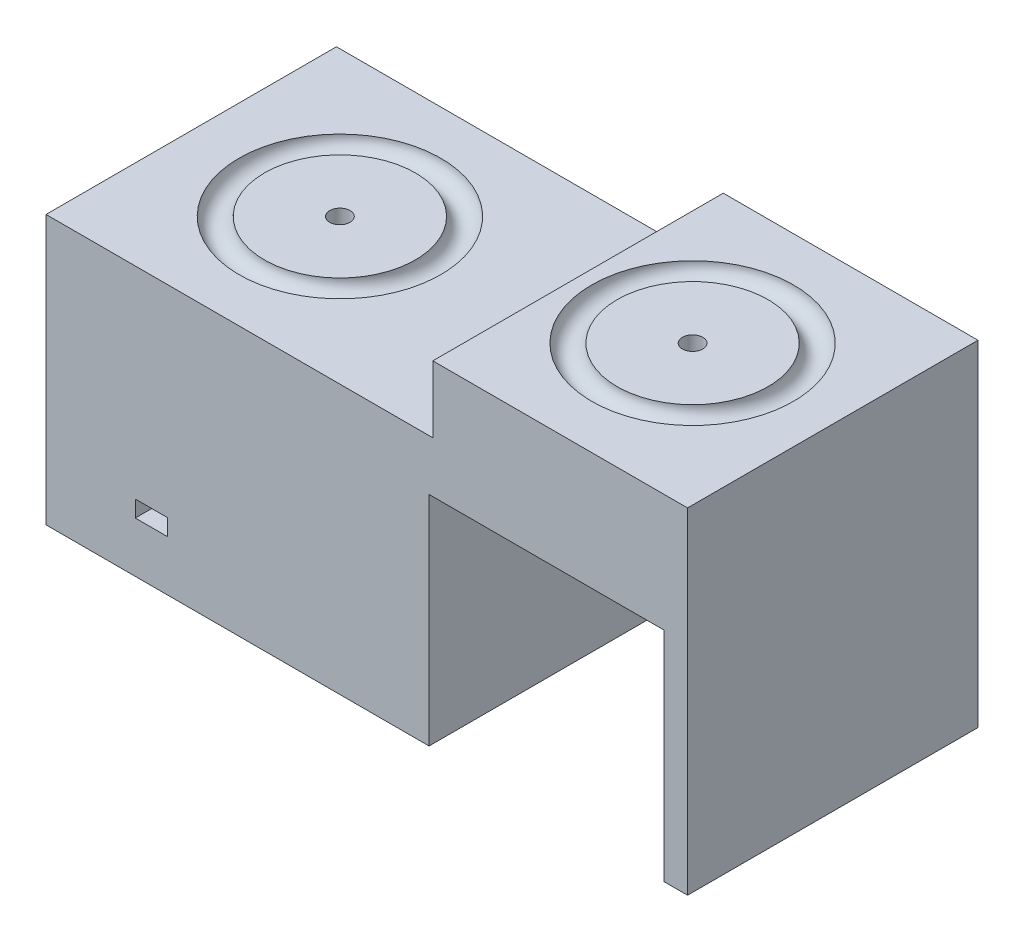
ISO-10303-21;
HEADER;
FILE_DESCRIPTION(('STEP AP214'),'2;1');
FILE_NAME('part.step','',(''),(''),'','','');
FILE_SCHEMA(('AUTOMOTIVE_DESIGN { 1 0 10303 214 1 1 1 1 }'));
ENDSEC;
DATA;
#1=APPLICATION_CONTEXT('core data for automotive mechanical design processes');
#2=APPLICATION_PROTOCOL_DEFINITION('international standard','automotive_design',2000,#1);
#3=PRODUCT_CONTEXT('',#1,'mechanical');
#4=PRODUCT('Part','Part','',(#3));
#5=PRODUCT_RELATED_PRODUCT_CATEGORY('part','',(#4));
#6=PRODUCT_DEFINITION_FORMATION('','',#4);
#7=PRODUCT_DEFINITION_CONTEXT('part definition',#1,'design');
#8=PRODUCT_DEFINITION('design','',#6,#7);
#9=PRODUCT_DEFINITION_SHAPE('','',#8);
#10=(LENGTH_UNIT() NAMED_UNIT(*) SI_UNIT(.MILLI.,.METRE.));
#11=(NAMED_UNIT(*) PLANE_ANGLE_UNIT() SI_UNIT($,.RADIAN.));
#12=(NAMED_UNIT(*) SI_UNIT($,.STERADIAN.) SOLID_ANGLE_UNIT());
#13=UNCERTAINTY_MEASURE_WITH_UNIT(LENGTH_MEASURE(1.E-05),#10,'distance_accuracy_value','');
#14=(GEOMETRIC_REPRESENTATION_CONTEXT(3) GLOBAL_UNCERTAINTY_ASSIGNED_CONTEXT((#13)) GLOBAL_UNIT_ASSIGNED_CONTEXT((#10,
#11,#12)) REPRESENTATION_CONTEXT('',''));
#15=CARTESIAN_POINT('',(0.,0.,0.));
#16=DIRECTION('',(0.,0.,1.));
#17=DIRECTION('',(1.,0.,0.));
#18=AXIS2_PLACEMENT_3D('',#15,#16,#17);
#19=CARTESIAN_POINT('',(0.,-51.6,65.2591921319689));
#20=DIRECTION('',(0.,0.,-1.));
#21=DIRECTION('',(-1.,0.,0.));
#22=AXIS2_PLACEMENT_3D('',#19,#20,#21);
#23=PLANE('',#22);
#24=DIRECTION('',(-1.,0.,0.));
#25=VECTOR('',#24,1.);
#26=CARTESIAN_POINT('',(0.,-38.7,65.2591921319689));
#27=LINE('',#26,#25);
#28=CARTESIAN_POINT('',(39.85,-38.7,65.2591921319689));
#29=VERTEX_POINT('',#28);
#30=CARTESIAN_POINT('',(31.65,-38.7,65.2591921319689));
#31=VERTEX_POINT('',#30);
#32=EDGE_CURVE('E298',#29,#31,#27,.T.);
#33=ORIENTED_EDGE('',*,*,#32,.T.);
#34=DIRECTION('',(0.,1.,0.));
#35=VECTOR('',#34,1.);
#36=CARTESIAN_POINT('',(31.65,-51.6,65.2591921319689));
#37=LINE('',#36,#35);
#38=CARTESIAN_POINT('',(31.65,-34.5,65.2591921319689));
#39=VERTEX_POINT('',#38);
#40=EDGE_CURVE('E304',#31,#39,#37,.T.);
#41=ORIENTED_EDGE('',*,*,#40,.T.);
#42=DIRECTION('',(1.,0.,0.));
#43=VECTOR('',#42,1.);
#44=CARTESIAN_POINT('',(0.,-34.5,65.2591921319689));
#45=LINE('',#44,#43);
#46=CARTESIAN_POINT('',(39.85,-34.5,65.2591921319689));
#47=VERTEX_POINT('',#46);
#48=EDGE_CURVE('E288',#39,#47,#45,.T.);
#49=ORIENTED_EDGE('',*,*,#48,.T.);
#50=DIRECTION('',(0.,-1.,0.));
#51=VECTOR('',#50,1.);
#52=CARTESIAN_POINT('',(39.85,-51.6,65.2591921319689));
#53=LINE('',#52,#51);
#54=EDGE_CURVE('E301',#47,#29,#53,.T.);
#55=ORIENTED_EDGE('',*,*,#54,.T.);
#56=EDGE_LOOP('',(#33,#41,#49,#55));
#57=FACE_BOUND('',#56,.T.);
#58=DIRECTION('',(0.,-1.,0.));
#59=VECTOR('',#58,1.);
#60=CARTESIAN_POINT('',(106.616116329824,-51.6,65.2591921319689));
#61=LINE('',#60,#59);
#62=CARTESIAN_POINT('',(106.616116329824,4.,65.2591921319689));
#63=VERTEX_POINT('',#62);
#64=CARTESIAN_POINT('',(106.616116329824,-51.6,65.2591921319689));
#65=VERTEX_POINT('',#64);
#66=EDGE_CURVE('E420',#63,#65,#61,.T.);
#67=ORIENTED_EDGE('',*,*,#66,.F.);
#68=DIRECTION('',(-1.,0.,0.));
#69=VECTOR('',#68,1.);
#70=CARTESIAN_POINT('',(0.,4.,65.2591921319689));
#71=LINE('',#70,#69);
#72=CARTESIAN_POINT('',(166.616116329824,4.,65.2591921319689));
#73=VERTEX_POINT('',#72);
#74=EDGE_CURVE('E433',#73,#63,#71,.T.);
#75=ORIENTED_EDGE('',*,*,#74,.F.);
#76=DIRECTION('',(0.,-1.,0.));
#77=VECTOR('',#76,1.);
#78=CARTESIAN_POINT('',(166.616116329824,-51.6,65.2591921319689));
#79=LINE('',#78,#77);
#80=CARTESIAN_POINT('',(166.616116329824,-51.6,65.2591921319689));
#81=VERTEX_POINT('',#80);
#82=EDGE_CURVE('E431',#73,#81,#79,.T.);
#83=ORIENTED_EDGE('',*,*,#82,.T.);
#84=DIRECTION('',(-1.,0.,0.));
#85=VECTOR('',#84,1.);
#86=CARTESIAN_POINT('',(0.,-51.6,65.2591921319689));
#87=LINE('',#86,#85);
#88=CARTESIAN_POINT('',(172.574486704563,-51.6,65.2591921319689));
#89=VERTEX_POINT('',#88);
#90=EDGE_CURVE('E226',#89,#81,#87,.T.);
#91=ORIENTED_EDGE('',*,*,#90,.F.);
#92=DIRECTION('',(0.,1.,0.));
#93=VECTOR('',#92,1.);
#94=CARTESIAN_POINT('',(172.574486704563,-51.6,65.2591921319689));
#95=LINE('',#94,#93);
#96=CARTESIAN_POINT('',(172.574486704563,34.,65.2591921319689));
#97=VERTEX_POINT('',#96);
#98=EDGE_CURVE('E362',#89,#97,#95,.T.);
#99=ORIENTED_EDGE('',*,*,#98,.T.);
#100=DIRECTION('',(1.,0.,0.));
#101=VECTOR('',#100,1.);
#102=CARTESIAN_POINT('',(172.574486704563,34.,65.2591921319689));
#103=LINE('',#102,#101);
#104=CARTESIAN_POINT('',(107.568912022522,34.,65.2591921319689));
#105=VERTEX_POINT('',#104);
#106=EDGE_CURVE('E336',#105,#97,#103,.T.);
#107=ORIENTED_EDGE('',*,*,#106,.F.);
#108=DIRECTION('',(0.,1.,0.));
#109=VECTOR('',#108,1.);
#110=CARTESIAN_POINT('',(107.568912022522,-5.6,65.2591921319689));
#111=LINE('',#110,#109);
#112=CARTESIAN_POINT('',(107.568912022522,17.,65.2591921319689));
#113=VERTEX_POINT('',#112);
#114=EDGE_CURVE('E340',#113,#105,#111,.T.);
#115=ORIENTED_EDGE('',*,*,#114,.F.);
#116=DIRECTION('',(1.,0.,0.));
#117=VECTOR('',#116,1.);
#118=CARTESIAN_POINT('',(8.85919213196888,17.,65.2591921319689));
#119=LINE('',#118,#117);
#120=CARTESIAN_POINT('',(8.85919213196888,17.,65.2591921319689));
#121=VERTEX_POINT('',#120);
#122=EDGE_CURVE('E355',#121,#113,#119,.T.);
#123=ORIENTED_EDGE('',*,*,#122,.F.);
#124=DIRECTION('',(0.,1.,0.));
#125=VECTOR('',#124,1.);
#126=CARTESIAN_POINT('',(8.85919213196888,-51.6,65.2591921319689));
#127=LINE('',#126,#125);
#128=CARTESIAN_POINT('',(8.85919213196888,-51.6,65.2591921319689));
#129=VERTEX_POINT('',#128);
#130=EDGE_CURVE('E360',#129,#121,#127,.T.);
#131=ORIENTED_EDGE('',*,*,#130,.F.);
#132=EDGE_CURVE('E233',#65,#129,#87,.T.);
#133=ORIENTED_EDGE('',*,*,#132,.F.);
#134=EDGE_LOOP('',(#67,#75,#83,#91,#99,#107,#115,#123,#131,#133));
#135=FACE_BOUND('',#134,.T.);
#136=ADVANCED_FACE('F43',(#57,#135),#23,.F.);
#137=CARTESIAN_POINT('',(0.,-51.6,0.));
#138=DIRECTION('',(0.,-1.,0.));
#139=DIRECTION('',(0.,0.,-1.));
#140=AXIS2_PLACEMENT_3D('',#137,#138,#139);
#141=PLANE('',#140);
#142=CARTESIAN_POINT('',(35.75,-51.6,12.9));
#143=DIRECTION('',(0.,-1.,0.));
#144=DIRECTION('',(0.,0.,-1.));
#145=AXIS2_PLACEMENT_3D('',#142,#143,#144);
#146=CIRCLE('',#145,2.6);
#147=CARTESIAN_POINT('',(35.75,-51.6,10.3));
#148=VERTEX_POINT('',#147);
#149=EDGE_CURVE('E311',#148,#148,#146,.T.);
#150=ORIENTED_EDGE('',*,*,#149,.F.);
#151=EDGE_LOOP('',(#150));
#152=FACE_BOUND('',#151,.T.);
#153=CARTESIAN_POINT('',(35.75,-51.6,43.5));
#154=DIRECTION('',(0.,-1.,0.));
#155=DIRECTION('',(0.,0.,-1.));
#156=AXIS2_PLACEMENT_3D('',#153,#154,#155);
#157=CIRCLE('',#156,2.6);
#158=CARTESIAN_POINT('',(35.75,-51.6,40.9));
#159=VERTEX_POINT('',#158);
#160=EDGE_CURVE('E315',#159,#159,#157,.T.);
#161=ORIENTED_EDGE('',*,*,#160,.F.);
#162=EDGE_LOOP('',(#161));
#163=FACE_BOUND('',#162,.T.);
#164=CARTESIAN_POINT('',(46.8,-51.6,28.2));
#165=DIRECTION('',(0.,-1.,0.));
#166=DIRECTION('',(0.,0.,-1.));
#167=AXIS2_PLACEMENT_3D('',#164,#165,#166);
#168=CIRCLE('',#167,12.);
#169=CARTESIAN_POINT('',(46.8,-51.6,16.2));
#170=VERTEX_POINT('',#169);
#171=EDGE_CURVE('E312',#170,#170,#168,.T.);
#172=ORIENTED_EDGE('',*,*,#171,.F.);
#173=EDGE_LOOP('',(#172));
#174=FACE_BOUND('',#173,.T.);
#175=DIRECTION('',(-1.,0.,0.));
#176=VECTOR('',#175,1.);
#177=CARTESIAN_POINT('',(0.,-51.6,-8.85919213196887));
#178=LINE('',#177,#176);
#179=CARTESIAN_POINT('',(106.616116329824,-51.6,-8.85919213196887));
#180=VERTEX_POINT('',#179);
#181=CARTESIAN_POINT('',(8.85919213196888,-51.6,-8.85919213196887));
#182=VERTEX_POINT('',#181);
#183=EDGE_CURVE('E234',#180,#182,#178,.T.);
#184=ORIENTED_EDGE('',*,*,#183,.F.);
#185=DIRECTION('',(0.,0.,-1.));
#186=VECTOR('',#185,1.);
#187=CARTESIAN_POINT('',(106.616116329824,-51.6,81.1408078680311));
#188=LINE('',#187,#186);
#189=EDGE_CURVE('E227',#65,#180,#188,.T.);
#190=ORIENTED_EDGE('',*,*,#189,.F.);
#191=ORIENTED_EDGE('',*,*,#132,.T.);
#192=DIRECTION('',(0.,0.,-1.));
#193=VECTOR('',#192,1.);
#194=CARTESIAN_POINT('',(8.85919213196888,-51.6,0.));
#195=LINE('',#194,#193);
#196=EDGE_CURVE('E239',#129,#182,#195,.T.);
#197=ORIENTED_EDGE('',*,*,#196,.T.);
#198=EDGE_LOOP('',(#184,#190,#191,#197));
#199=FACE_BOUND('',#198,.T.);
#200=ADVANCED_FACE('F449',(#152,#163,#174,#199),#141,.T.);
#201=CARTESIAN_POINT('',(0.,-51.6,-8.85919213196887));
#202=DIRECTION('',(0.,0.,-1.));
#203=DIRECTION('',(-1.,0.,0.));
#204=AXIS2_PLACEMENT_3D('',#201,#202,#203);
#205=PLANE('',#204);
#206=DIRECTION('',(0.,1.,0.));
#207=VECTOR('',#206,1.);
#208=CARTESIAN_POINT('',(31.65,-34.5,-8.85919213196887));
#209=LINE('',#208,#207);
#210=CARTESIAN_POINT('',(31.65,-38.7,-8.85919213196887));
#211=VERTEX_POINT('',#210);
#212=CARTESIAN_POINT('',(31.65,-34.5,-8.85919213196887));
#213=VERTEX_POINT('',#212);
#214=EDGE_CURVE('E259',#211,#213,#209,.T.);
#215=ORIENTED_EDGE('',*,*,#214,.F.);
#216=DIRECTION('',(-1.,0.,0.));
#217=VECTOR('',#216,1.);
#218=CARTESIAN_POINT('',(39.85,-38.7,-8.85919213196887));
#219=LINE('',#218,#217);
#220=CARTESIAN_POINT('',(39.85,-38.7,-8.85919213196887));
#221=VERTEX_POINT('',#220);
#222=EDGE_CURVE('E267',#221,#211,#219,.T.);
#223=ORIENTED_EDGE('',*,*,#222,.F.);
#224=DIRECTION('',(0.,-1.,0.));
#225=VECTOR('',#224,1.);
#226=CARTESIAN_POINT('',(39.85,-34.5,-8.85919213196887));
#227=LINE('',#226,#225);
#228=CARTESIAN_POINT('',(39.85,-34.5,-8.85919213196887));
#229=VERTEX_POINT('',#228);
#230=EDGE_CURVE('E264',#229,#221,#227,.T.);
#231=ORIENTED_EDGE('',*,*,#230,.F.);
#232=DIRECTION('',(1.,0.,0.));
#233=VECTOR('',#232,1.);
#234=CARTESIAN_POINT('',(39.85,-34.5,-8.85919213196887));
#235=LINE('',#234,#233);
#236=EDGE_CURVE('E261',#213,#229,#235,.T.);
#237=ORIENTED_EDGE('',*,*,#236,.F.);
#238=EDGE_LOOP('',(#215,#223,#231,#237));
#239=FACE_BOUND('',#238,.T.);
#240=DIRECTION('',(-1.,0.,0.));
#241=VECTOR('',#240,1.);
#242=CARTESIAN_POINT('',(136.616116329824,4.,-8.85919213196887));
#243=LINE('',#242,#241);
#244=CARTESIAN_POINT('',(166.616116329824,4.,-8.85919213196887));
#245=VERTEX_POINT('',#244);
#246=CARTESIAN_POINT('',(106.616116329824,4.,-8.85919213196887));
#247=VERTEX_POINT('',#246);
#248=EDGE_CURVE('E59',#245,#247,#243,.T.);
#249=ORIENTED_EDGE('',*,*,#248,.T.);
#250=DIRECTION('',(0.,-1.,0.));
#251=VECTOR('',#250,1.);
#252=CARTESIAN_POINT('',(106.616116329824,4.,-8.85919213196887));
#253=LINE('',#252,#251);
#254=EDGE_CURVE('E219',#247,#180,#253,.T.);
#255=ORIENTED_EDGE('',*,*,#254,.T.);
#256=ORIENTED_EDGE('',*,*,#183,.T.);
#257=DIRECTION('',(0.,1.,0.));
#258=VECTOR('',#257,1.);
#259=CARTESIAN_POINT('',(8.85919213196888,-51.6,-8.85919213196887));
#260=LINE('',#259,#258);
#261=CARTESIAN_POINT('',(8.85919213196888,17.,-8.85919213196887));
#262=VERTEX_POINT('',#261);
#263=EDGE_CURVE('E242',#182,#262,#260,.T.);
#264=ORIENTED_EDGE('',*,*,#263,.T.);
#265=DIRECTION('',(1.,0.,0.));
#266=VECTOR('',#265,1.);
#267=CARTESIAN_POINT('',(8.85919213196888,17.,-8.85919213196887));
#268=LINE('',#267,#266);
#269=CARTESIAN_POINT('',(107.568912022522,17.,-8.85919213196887));
#270=VERTEX_POINT('',#269);
#271=EDGE_CURVE('E352',#262,#270,#268,.T.);
#272=ORIENTED_EDGE('',*,*,#271,.T.);
#273=DIRECTION('',(0.,1.,0.));
#274=VECTOR('',#273,1.);
#275=CARTESIAN_POINT('',(107.568912022522,-5.6,-8.85919213196887));
#276=LINE('',#275,#274);
#277=CARTESIAN_POINT('',(107.568912022522,34.,-8.85919213196887));
#278=VERTEX_POINT('',#277);
#279=EDGE_CURVE('E339',#270,#278,#276,.T.);
#280=ORIENTED_EDGE('',*,*,#279,.T.);
#281=DIRECTION('',(-1.,0.,0.));
#282=VECTOR('',#281,1.);
#283=CARTESIAN_POINT('',(172.574486704563,34.,-8.85919213196887));
#284=LINE('',#283,#282);
#285=CARTESIAN_POINT('',(172.574486704563,34.,-8.85919213196887));
#286=VERTEX_POINT('',#285);
#287=EDGE_CURVE('E330',#286,#278,#284,.T.);
#288=ORIENTED_EDGE('',*,*,#287,.F.);
#289=DIRECTION('',(0.,1.,0.));
#290=VECTOR('',#289,1.);
#291=CARTESIAN_POINT('',(172.574486704563,-51.6,-8.85919213196887));
#292=LINE('',#291,#290);
#293=CARTESIAN_POINT('',(172.574486704563,-51.6,-8.85919213196887));
#294=VERTEX_POINT('',#293);
#295=EDGE_CURVE('E231',#294,#286,#292,.T.);
#296=ORIENTED_EDGE('',*,*,#295,.F.);
#297=CARTESIAN_POINT('',(166.616116329824,-51.6,-8.85919213196887));
#298=VERTEX_POINT('',#297);
#299=EDGE_CURVE('E224',#294,#298,#178,.T.);
#300=ORIENTED_EDGE('',*,*,#299,.T.);
#301=DIRECTION('',(0.,-1.,0.));
#302=VECTOR('',#301,1.);
#303=CARTESIAN_POINT('',(166.616116329824,4.,-8.85919213196887));
#304=LINE('',#303,#302);
#305=EDGE_CURVE('E211',#245,#298,#304,.T.);
#306=ORIENTED_EDGE('',*,*,#305,.F.);
#307=EDGE_LOOP('',(#249,#255,#256,#264,#272,#280,#288,#296,#300,#306));
#308=FACE_BOUND('',#307,.T.);
#309=ADVANCED_FACE('F229',(#239,#308),#205,.T.);
#310=CARTESIAN_POINT('',(136.8,24.,28.2));
#311=DIRECTION('',(0.,-1.,0.));
#312=DIRECTION('',(0.,0.,-1.));
#313=AXIS2_PLACEMENT_3D('',#310,#311,#312);
#314=CYLINDRICAL_SURFACE('',#313,20.5);
#315=CARTESIAN_POINT('',(136.8,17.,28.2));
#316=DIRECTION('',(0.,-1.,0.));
#317=DIRECTION('',(0.,0.,-1.));
#318=AXIS2_PLACEMENT_3D('',#315,#316,#317);
#319=CIRCLE('',#318,20.5);
#320=CARTESIAN_POINT('',(136.8,17.,7.70000000000002));
#321=VERTEX_POINT('',#320);
#322=CARTESIAN_POINT('',(136.8,17.,48.7));
#323=VERTEX_POINT('',#322);
#324=EDGE_CURVE('E12',#321,#323,#319,.F.);
#325=ORIENTED_EDGE('',*,*,#324,.T.);
#326=DIRECTION('',(0.,1.,0.));
#327=VECTOR('',#326,1.);
#328=CARTESIAN_POINT('',(136.8,29.5637733454495,48.7));
#329=LINE('',#328,#327);
#330=CARTESIAN_POINT('',(136.8,24.,48.7));
#331=VERTEX_POINT('',#330);
#332=EDGE_CURVE('E424',#323,#331,#329,.T.);
#333=ORIENTED_EDGE('',*,*,#332,.T.);
#334=CARTESIAN_POINT('',(136.8,24.,28.2));
#335=DIRECTION('',(0.,-1.,0.));
#336=DIRECTION('',(0.,0.,-1.));
#337=AXIS2_PLACEMENT_3D('',#334,#335,#336);
#338=CIRCLE('',#337,20.5);
#339=CARTESIAN_POINT('',(136.8,24.,7.70000000000001));
#340=VERTEX_POINT('',#339);
#341=EDGE_CURVE('E246',#340,#331,#338,.T.);
#342=ORIENTED_EDGE('',*,*,#341,.F.);
#343=DIRECTION('',(0.,-1.,0.));
#344=VECTOR('',#343,1.);
#345=CARTESIAN_POINT('',(136.8,24.,7.70000000000002));
#346=LINE('',#345,#344);
#347=EDGE_CURVE('E52',#340,#321,#346,.T.);
#348=ORIENTED_EDGE('',*,*,#347,.T.);
#349=EDGE_LOOP('',(#325,#333,#342,#348));
#350=FACE_BOUND('',#349,.T.);
#351=CARTESIAN_POINT('',(136.8,4.,28.2));
#352=DIRECTION('',(0.,-1.,0.));
#353=DIRECTION('',(0.,0.,-1.));
#354=AXIS2_PLACEMENT_3D('',#351,#352,#353);
#355=CIRCLE('',#354,20.5);
#356=CARTESIAN_POINT('',(136.8,4.,7.70000000000002));
#357=VERTEX_POINT('',#356);
#358=EDGE_CURVE('E47',#357,#357,#355,.F.);
#359=ORIENTED_EDGE('',*,*,#358,.F.);
#360=EDGE_LOOP('',(#359));
#361=FACE_BOUND('',#360,.T.);
#362=ADVANCED_FACE('F489',(#350,#361),#314,.F.);
#363=CARTESIAN_POINT('',(136.8,189.,28.2));
#364=DIRECTION('',(0.,-1.,0.));
#365=DIRECTION('',(0.,0.,-1.));
#366=AXIS2_PLACEMENT_3D('',#363,#364,#365);
#367=CYLINDRICAL_SURFACE('',#366,2.59999999999999);
#368=CARTESIAN_POINT('',(136.8,34.,28.2));
#369=DIRECTION('',(0.,1.,0.));
#370=DIRECTION('',(0.,0.,1.));
#371=AXIS2_PLACEMENT_3D('',#368,#369,#370);
#372=CIRCLE('',#371,2.59999999999999);
#373=CARTESIAN_POINT('',(136.8,34.,30.8));
#374=VERTEX_POINT('',#373);
#375=EDGE_CURVE('E256',#374,#374,#372,.T.);
#376=ORIENTED_EDGE('',*,*,#375,.T.);
#377=EDGE_LOOP('',(#376));
#378=FACE_BOUND('',#377,.T.);
#379=CARTESIAN_POINT('',(136.8,24.,28.2));
#380=DIRECTION('',(0.,-1.,0.));
#381=DIRECTION('',(0.,0.,-1.));
#382=AXIS2_PLACEMENT_3D('',#379,#380,#381);
#383=CIRCLE('',#382,2.59999999999999);
#384=CARTESIAN_POINT('',(136.8,24.,30.8));
#385=VERTEX_POINT('',#384);
#386=CARTESIAN_POINT('',(136.8,24.,25.6));
#387=VERTEX_POINT('',#386);
#388=EDGE_CURVE('E243',#385,#387,#383,.F.);
#389=ORIENTED_EDGE('',*,*,#388,.F.);
#390=DIRECTION('',(0.,-1.,0.));
#391=VECTOR('',#390,1.);
#392=CARTESIAN_POINT('',(136.8,189.,30.8));
#393=LINE('',#392,#391);
#394=CARTESIAN_POINT('',(136.8,29.5637733454495,30.8));
#395=VERTEX_POINT('',#394);
#396=EDGE_CURVE('E398',#385,#395,#393,.F.);
#397=ORIENTED_EDGE('',*,*,#396,.T.);
#398=CARTESIAN_POINT('',(136.8,29.5637733454495,28.2));
#399=DIRECTION('',(0.,1.,0.));
#400=DIRECTION('',(0.,0.,1.));
#401=AXIS2_PLACEMENT_3D('',#398,#399,#400);
#402=CIRCLE('',#401,2.59999999999999);
#403=CARTESIAN_POINT('',(136.8,29.5637733454495,25.6));
#404=VERTEX_POINT('',#403);
#405=EDGE_CURVE('E391',#395,#404,#402,.F.);
#406=ORIENTED_EDGE('',*,*,#405,.T.);
#407=DIRECTION('',(0.,-1.,0.));
#408=VECTOR('',#407,1.);
#409=CARTESIAN_POINT('',(136.8,189.,25.6));
#410=LINE('',#409,#408);
#411=EDGE_CURVE('E394',#404,#387,#410,.T.);
#412=ORIENTED_EDGE('',*,*,#411,.T.);
#413=EDGE_LOOP('',(#389,#397,#406,#412));
#414=FACE_BOUND('',#413,.T.);
#415=ADVANCED_FACE('F492',(#378,#414),#367,.F.);
#416=CARTESIAN_POINT('',(8.85919213196888,-5.60000000000001,65.2591921319689));
#417=DIRECTION('',(-1.,0.,0.));
#418=DIRECTION('',(0.,0.,1.));
#419=AXIS2_PLACEMENT_3D('',#416,#417,#418);
#420=PLANE('',#419);
#421=ORIENTED_EDGE('',*,*,#196,.F.);
#422=ORIENTED_EDGE('',*,*,#130,.T.);
#423=DIRECTION('',(0.,0.,-1.));
#424=VECTOR('',#423,1.);
#425=CARTESIAN_POINT('',(8.85919213196888,17.,65.2591921319689));
#426=LINE('',#425,#424);
#427=EDGE_CURVE('E349',#121,#262,#426,.T.);
#428=ORIENTED_EDGE('',*,*,#427,.T.);
#429=ORIENTED_EDGE('',*,*,#263,.F.);
#430=EDGE_LOOP('',(#421,#422,#428,#429));
#431=FACE_BOUND('',#430,.T.);
#432=ADVANCED_FACE('F454',(#431),#420,.T.);
#433=CARTESIAN_POINT('',(46.8,172.,28.2));
#434=DIRECTION('',(0.,-1.,0.));
#435=DIRECTION('',(0.,0.,-1.));
#436=AXIS2_PLACEMENT_3D('',#433,#434,#435);
#437=CYLINDRICAL_SURFACE('',#436,2.6);
#438=CARTESIAN_POINT('',(46.8,1.99999999999999,28.2));
#439=DIRECTION('',(0.,-1.,0.));
#440=DIRECTION('',(0.,0.,-1.));
#441=AXIS2_PLACEMENT_3D('',#438,#439,#440);
#442=CIRCLE('',#441,2.6);
#443=CARTESIAN_POINT('',(46.8,1.99999999999999,25.6));
#444=VERTEX_POINT('',#443);
#445=EDGE_CURVE('E248',#444,#444,#442,.T.);
#446=ORIENTED_EDGE('',*,*,#445,.T.);
#447=EDGE_LOOP('',(#446));
#448=FACE_BOUND('',#447,.T.);
#449=CARTESIAN_POINT('',(46.8,17.,28.2));
#450=DIRECTION('',(0.,-1.,0.));
#451=DIRECTION('',(0.,0.,-1.));
#452=AXIS2_PLACEMENT_3D('',#449,#450,#451);
#453=CIRCLE('',#452,2.6);
#454=CARTESIAN_POINT('',(46.8,17.,25.6));
#455=VERTEX_POINT('',#454);
#456=EDGE_CURVE('E252',#455,#455,#453,.T.);
#457=ORIENTED_EDGE('',*,*,#456,.F.);
#458=EDGE_LOOP('',(#457));
#459=FACE_BOUND('',#458,.T.);
#460=ADVANCED_FACE('F598',(#448,#459),#437,.F.);
#461=CARTESIAN_POINT('',(0.,34.,0.));
#462=DIRECTION('',(0.,1.,0.));
#463=DIRECTION('',(0.,0.,1.));
#464=AXIS2_PLACEMENT_3D('',#461,#462,#463);
#465=PLANE('',#464);
#466=ORIENTED_EDGE('',*,*,#375,.F.);
#467=EDGE_LOOP('',(#466));
#468=FACE_BOUND('',#467,.T.);
#469=CARTESIAN_POINT('',(136.8,34.,28.2));
#470=DIRECTION('',(0.,-1.,0.));
#471=DIRECTION('',(0.,0.,-1.));
#472=AXIS2_PLACEMENT_3D('',#469,#470,#471);
#473=CIRCLE('',#472,19.25);
#474=CARTESIAN_POINT('',(117.55,34.,28.2));
#475=VERTEX_POINT('',#474);
#476=EDGE_CURVE('E371',#475,#475,#473,.F.);
#477=ORIENTED_EDGE('',*,*,#476,.T.);
#478=EDGE_LOOP('',(#477));
#479=FACE_BOUND('',#478,.T.);
#480=ADVANCED_FACE('F573',(#468,#479),#465,.T.);
#481=CARTESIAN_POINT('',(35.75,-21.6,43.5));
#482=DIRECTION('',(0.,-1.,0.));
#483=DIRECTION('',(0.,0.,-1.));
#484=AXIS2_PLACEMENT_3D('',#481,#482,#483);
#485=PLANE('',#484);
#486=CARTESIAN_POINT('',(35.75,-21.6,43.5));
#487=DIRECTION('',(0.,-1.,0.));
#488=DIRECTION('',(0.,0.,-1.));
#489=AXIS2_PLACEMENT_3D('',#486,#487,#488);
#490=CIRCLE('',#489,2.6);
#491=CARTESIAN_POINT('',(35.75,-21.6,40.9));
#492=VERTEX_POINT('',#491);
#493=EDGE_CURVE('E307',#492,#492,#490,.T.);
#494=ORIENTED_EDGE('',*,*,#493,.T.);
#495=EDGE_LOOP('',(#494));
#496=FACE_BOUND('',#495,.T.);
#497=ADVANCED_FACE('F566',(#496),#485,.T.);
#498=CARTESIAN_POINT('',(0.,-21.6,0.));
#499=DIRECTION('',(0.,-1.,0.));
#500=DIRECTION('',(0.,0.,-1.));
#501=AXIS2_PLACEMENT_3D('',#498,#499,#500);
#502=PLANE('',#501);
#503=CARTESIAN_POINT('',(35.75,-21.6,12.9));
#504=DIRECTION('',(0.,-1.,0.));
#505=DIRECTION('',(0.,0.,-1.));
#506=AXIS2_PLACEMENT_3D('',#503,#504,#505);
#507=CIRCLE('',#506,2.6);
#508=CARTESIAN_POINT('',(35.75,-21.6,10.3));
#509=VERTEX_POINT('',#508);
#510=EDGE_CURVE('E308',#509,#509,#507,.T.);
#511=ORIENTED_EDGE('',*,*,#510,.T.);
#512=EDGE_LOOP('',(#511));
#513=FACE_BOUND('',#512,.T.);
#514=ADVANCED_FACE('F555',(#513),#502,.T.);
#515=CARTESIAN_POINT('',(46.8,1.99999999999999,28.2));
#516=DIRECTION('',(0.,-1.,0.));
#517=DIRECTION('',(0.,0.,-1.));
#518=AXIS2_PLACEMENT_3D('',#515,#516,#517);
#519=PLANE('',#518);
#520=ORIENTED_EDGE('',*,*,#445,.F.);
#521=EDGE_LOOP('',(#520));
#522=FACE_BOUND('',#521,.T.);
#523=CARTESIAN_POINT('',(46.8,1.99999999999999,28.2));
#524=DIRECTION('',(0.,-1.,0.));
#525=DIRECTION('',(0.,0.,-1.));
#526=AXIS2_PLACEMENT_3D('',#523,#524,#525);
#527=CIRCLE('',#526,12.);
#528=CARTESIAN_POINT('',(46.8,1.99999999999999,16.2));
#529=VERTEX_POINT('',#528);
#530=EDGE_CURVE('E320',#529,#529,#527,.T.);
#531=ORIENTED_EDGE('',*,*,#530,.T.);
#532=EDGE_LOOP('',(#531));
#533=FACE_BOUND('',#532,.T.);
#534=ADVANCED_FACE('F552',(#522,#533),#519,.T.);
#535=CARTESIAN_POINT('',(0.,17.,0.));
#536=DIRECTION('',(0.,-1.,0.));
#537=DIRECTION('',(0.,0.,-1.));
#538=AXIS2_PLACEMENT_3D('',#535,#536,#537);
#539=PLANE('',#538);
#540=ORIENTED_EDGE('',*,*,#456,.T.);
#541=EDGE_LOOP('',(#540));
#542=FACE_BOUND('',#541,.T.);
#543=CARTESIAN_POINT('',(46.8,17.,28.2));
#544=DIRECTION('',(0.,1.,0.));
#545=DIRECTION('',(0.,0.,1.));
#546=AXIS2_PLACEMENT_3D('',#543,#544,#545);
#547=CIRCLE('',#546,19.25);
#548=CARTESIAN_POINT('',(27.55,17.,28.2));
#549=VERTEX_POINT('',#548);
#550=EDGE_CURVE('E237',#549,#549,#547,.F.);
#551=ORIENTED_EDGE('',*,*,#550,.F.);
#552=EDGE_LOOP('',(#551));
#553=FACE_BOUND('',#552,.T.);
#554=ADVANCED_FACE('F554',(#542,#553),#539,.F.);
#555=CARTESIAN_POINT('',(136.8,34.,28.2));
#556=DIRECTION('',(0.,1.,0.));
#557=DIRECTION('',(0.,0.,1.));
#558=AXIS2_PLACEMENT_3D('',#555,#556,#557);
#559=TOROIDAL_SURFACE('',#558,22.5,3.25000000000001);
#560=CARTESIAN_POINT('',(114.3,34.,28.2));
#561=DIRECTION('',(0.,0.,-1.));
#562=DIRECTION('',(-1.,0.,0.));
#563=AXIS2_PLACEMENT_3D('',#560,#561,#562);
#564=CIRCLE('',#563,3.25000000000001);
#565=CARTESIAN_POINT('',(111.05,34.,28.2));
#566=VERTEX_POINT('',#565);
#567=EDGE_CURVE('E323',#475,#566,#564,.T.);
#568=ORIENTED_EDGE('',*,*,#567,.F.);
#569=ORIENTED_EDGE('',*,*,#476,.F.);
#570=ORIENTED_EDGE('',*,*,#567,.T.);
#571=CARTESIAN_POINT('',(136.8,34.,28.2));
#572=DIRECTION('',(0.,1.,0.));
#573=DIRECTION('',(0.,0.,1.));
#574=AXIS2_PLACEMENT_3D('',#571,#572,#573);
#575=CIRCLE('',#574,25.75);
#576=EDGE_CURVE('E374',#566,#566,#575,.F.);
#577=ORIENTED_EDGE('',*,*,#576,.F.);
#578=EDGE_LOOP('',(#568,#569,#570,#577));
#579=FACE_BOUND('',#578,.T.);
#580=ADVANCED_FACE('F562',(#579),#559,.F.);
#581=CARTESIAN_POINT('',(35.75,-21.6,43.5));
#582=DIRECTION('',(0.,-1.,0.));
#583=DIRECTION('',(0.,0.,-1.));
#584=AXIS2_PLACEMENT_3D('',#581,#582,#583);
#585=CYLINDRICAL_SURFACE('',#584,2.6);
#586=CARTESIAN_POINT('',(35.75,-34.5,43.5));
#587=DIRECTION('',(0.,1.,0.));
#588=DIRECTION('',(0.,0.,1.));
#589=AXIS2_PLACEMENT_3D('',#586,#587,#588);
#590=CIRCLE('',#589,2.6);
#591=CARTESIAN_POINT('',(35.75,-34.5,46.1));
#592=VERTEX_POINT('',#591);
#593=EDGE_CURVE('E282',#592,#592,#590,.F.);
#594=ORIENTED_EDGE('',*,*,#593,.T.);
#595=EDGE_LOOP('',(#594));
#596=FACE_BOUND('',#595,.T.);
#597=ORIENTED_EDGE('',*,*,#493,.F.);
#598=EDGE_LOOP('',(#597));
#599=FACE_BOUND('',#598,.T.);
#600=ADVANCED_FACE('F575',(#596,#599),#585,.F.);
#601=CARTESIAN_POINT('',(35.75,-21.6,12.9));
#602=DIRECTION('',(0.,-1.,0.));
#603=DIRECTION('',(0.,0.,-1.));
#604=AXIS2_PLACEMENT_3D('',#601,#602,#603);
#605=CYLINDRICAL_SURFACE('',#604,2.6);
#606=CARTESIAN_POINT('',(35.75,-34.5,12.9));
#607=DIRECTION('',(0.,1.,0.));
#608=DIRECTION('',(0.,0.,1.));
#609=AXIS2_PLACEMENT_3D('',#606,#607,#608);
#610=CIRCLE('',#609,2.6);
#611=CARTESIAN_POINT('',(35.75,-34.5,15.5));
#612=VERTEX_POINT('',#611);
#613=EDGE_CURVE('E274',#612,#612,#610,.F.);
#614=ORIENTED_EDGE('',*,*,#613,.T.);
#615=EDGE_LOOP('',(#614));
#616=FACE_BOUND('',#615,.T.);
#617=ORIENTED_EDGE('',*,*,#510,.F.);
#618=EDGE_LOOP('',(#617));
#619=FACE_BOUND('',#618,.T.);
#620=ADVANCED_FACE('F578',(#616,#619),#605,.F.);
#621=CARTESIAN_POINT('',(35.75,-38.7,12.9));
#622=DIRECTION('',(0.,-1.,0.));
#623=DIRECTION('',(0.,0.,-1.));
#624=AXIS2_PLACEMENT_3D('',#621,#622,#623);
#625=CIRCLE('',#624,2.6);
#626=CARTESIAN_POINT('',(35.75,-38.7,10.3));
#627=VERTEX_POINT('',#626);
#628=EDGE_CURVE('E291',#627,#627,#625,.F.);
#629=ORIENTED_EDGE('',*,*,#628,.T.);
#630=EDGE_LOOP('',(#629));
#631=FACE_BOUND('',#630,.T.);
#632=ORIENTED_EDGE('',*,*,#149,.T.);
#633=EDGE_LOOP('',(#632));
#634=FACE_BOUND('',#633,.T.);
#635=ADVANCED_FACE('F581',(#631,#634),#605,.F.);
#636=CARTESIAN_POINT('',(35.75,-38.7,43.5));
#637=DIRECTION('',(0.,-1.,0.));
#638=DIRECTION('',(0.,0.,-1.));
#639=AXIS2_PLACEMENT_3D('',#636,#637,#638);
#640=CIRCLE('',#639,2.6);
#641=CARTESIAN_POINT('',(35.75,-38.7,40.9));
#642=VERTEX_POINT('',#641);
#643=EDGE_CURVE('E292',#642,#642,#640,.F.);
#644=ORIENTED_EDGE('',*,*,#643,.T.);
#645=EDGE_LOOP('',(#644));
#646=FACE_BOUND('',#645,.T.);
#647=ORIENTED_EDGE('',*,*,#160,.T.);
#648=EDGE_LOOP('',(#647));
#649=FACE_BOUND('',#648,.T.);
#650=ADVANCED_FACE('F545',(#646,#649),#585,.F.);
#651=CARTESIAN_POINT('',(46.8,1.99999999999999,28.2));
#652=DIRECTION('',(0.,-1.,0.));
#653=DIRECTION('',(0.,0.,-1.));
#654=AXIS2_PLACEMENT_3D('',#651,#652,#653);
#655=CYLINDRICAL_SURFACE('',#654,12.);
#656=DIRECTION('',(0.,-1.,0.));
#657=VECTOR('',#656,1.);
#658=CARTESIAN_POINT('',(39.85,1.99999999999999,18.4174900971172));
#659=LINE('',#658,#657);
#660=CARTESIAN_POINT('',(39.85,-34.5,18.4174900971172));
#661=VERTEX_POINT('',#660);
#662=CARTESIAN_POINT('',(39.85,-38.7,18.4174900971172));
#663=VERTEX_POINT('',#662);
#664=EDGE_CURVE('E377',#661,#663,#659,.T.);
#665=ORIENTED_EDGE('',*,*,#664,.T.);
#666=CARTESIAN_POINT('',(46.8,-38.7,28.2));
#667=DIRECTION('',(0.,-1.,0.));
#668=DIRECTION('',(0.,0.,-1.));
#669=AXIS2_PLACEMENT_3D('',#666,#667,#668);
#670=CIRCLE('',#669,12.);
#671=CARTESIAN_POINT('',(39.85,-38.7,37.9825099028828));
#672=VERTEX_POINT('',#671);
#673=EDGE_CURVE('E295',#663,#672,#670,.F.);
#674=ORIENTED_EDGE('',*,*,#673,.T.);
#675=DIRECTION('',(0.,-1.,0.));
#676=VECTOR('',#675,1.);
#677=CARTESIAN_POINT('',(39.85,1.99999999999999,37.9825099028828));
#678=LINE('',#677,#676);
#679=CARTESIAN_POINT('',(39.85,-34.5,37.9825099028828));
#680=VERTEX_POINT('',#679);
#681=EDGE_CURVE('E384',#672,#680,#678,.F.);
#682=ORIENTED_EDGE('',*,*,#681,.T.);
#683=CARTESIAN_POINT('',(46.8,-34.5,28.2));
#684=DIRECTION('',(0.,1.,0.));
#685=DIRECTION('',(0.,0.,1.));
#686=AXIS2_PLACEMENT_3D('',#683,#684,#685);
#687=CIRCLE('',#686,12.);
#688=EDGE_CURVE('E285',#680,#661,#687,.F.);
#689=ORIENTED_EDGE('',*,*,#688,.T.);
#690=EDGE_LOOP('',(#665,#674,#682,#689));
#691=FACE_BOUND('',#690,.T.);
#692=ORIENTED_EDGE('',*,*,#530,.F.);
#693=EDGE_LOOP('',(#692));
#694=FACE_BOUND('',#693,.T.);
#695=ORIENTED_EDGE('',*,*,#171,.T.);
#696=EDGE_LOOP('',(#695));
#697=FACE_BOUND('',#696,.T.);
#698=ADVANCED_FACE('F542',(#691,#694,#697),#655,.F.);
#699=CARTESIAN_POINT('',(39.85,-34.5,85.2591921319689));
#700=DIRECTION('',(1.,0.,0.));
#701=DIRECTION('',(0.,0.,-1.));
#702=AXIS2_PLACEMENT_3D('',#699,#700,#701);
#703=PLANE('',#702);
#704=DIRECTION('',(0.,0.,-1.));
#705=VECTOR('',#704,1.);
#706=CARTESIAN_POINT('',(39.85,-34.5,85.2591921319689));
#707=LINE('',#706,#705);
#708=EDGE_CURVE('E277',#47,#680,#707,.T.);
#709=ORIENTED_EDGE('',*,*,#708,.T.);
#710=ORIENTED_EDGE('',*,*,#681,.F.);
#711=DIRECTION('',(0.,0.,-1.));
#712=VECTOR('',#711,1.);
#713=CARTESIAN_POINT('',(39.85,-38.7,85.2591921319689));
#714=LINE('',#713,#712);
#715=EDGE_CURVE('E273',#29,#672,#714,.T.);
#716=ORIENTED_EDGE('',*,*,#715,.F.);
#717=ORIENTED_EDGE('',*,*,#54,.F.);
#718=EDGE_LOOP('',(#709,#710,#716,#717));
#719=FACE_BOUND('',#718,.T.);
#720=ADVANCED_FACE('F541',(#719),#703,.F.);
#721=CARTESIAN_POINT('',(46.8,17.,28.2));
#722=DIRECTION('',(0.,1.,0.));
#723=DIRECTION('',(0.,0.,1.));
#724=AXIS2_PLACEMENT_3D('',#721,#722,#723);
#725=TOROIDAL_SURFACE('',#724,22.5,3.25);
#726=CARTESIAN_POINT('',(46.8,17.,28.2));
#727=DIRECTION('',(0.,-1.,0.));
#728=DIRECTION('',(0.,0.,-1.));
#729=AXIS2_PLACEMENT_3D('',#726,#727,#728);
#730=CIRCLE('',#729,25.75);
#731=CARTESIAN_POINT('',(21.05,17.,28.2));
#732=VERTEX_POINT('',#731);
#733=EDGE_CURVE('E368',#732,#732,#730,.F.);
#734=ORIENTED_EDGE('',*,*,#733,.T.);
#735=CARTESIAN_POINT('',(24.3,17.,28.2));
#736=DIRECTION('',(0.,0.,-1.));
#737=DIRECTION('',(-1.,0.,0.));
#738=AXIS2_PLACEMENT_3D('',#735,#736,#737);
#739=CIRCLE('',#738,3.25);
#740=EDGE_CURVE('E347',#549,#732,#739,.T.);
#741=ORIENTED_EDGE('',*,*,#740,.F.);
#742=ORIENTED_EDGE('',*,*,#550,.T.);
#743=ORIENTED_EDGE('',*,*,#740,.T.);
#744=EDGE_LOOP('',(#734,#741,#742,#743));
#745=FACE_BOUND('',#744,.T.);
#746=ADVANCED_FACE('F592',(#745),#725,.F.);
#747=CARTESIAN_POINT('',(172.574486704563,-51.6,65.2591921319689));
#748=DIRECTION('',(1.,0.,0.));
#749=DIRECTION('',(0.,0.,-1.));
#750=AXIS2_PLACEMENT_3D('',#747,#748,#749);
#751=PLANE('',#750);
#752=DIRECTION('',(0.,0.,-1.));
#753=VECTOR('',#752,1.);
#754=CARTESIAN_POINT('',(172.574486704563,34.,65.2591921319689));
#755=LINE('',#754,#753);
#756=EDGE_CURVE('E327',#97,#286,#755,.T.);
#757=ORIENTED_EDGE('',*,*,#756,.F.);
#758=ORIENTED_EDGE('',*,*,#98,.F.);
#759=DIRECTION('',(0.,0.,-1.));
#760=VECTOR('',#759,1.);
#761=CARTESIAN_POINT('',(172.574486704563,-51.6,65.2591921319689));
#762=LINE('',#761,#760);
#763=EDGE_CURVE('E358',#89,#294,#762,.T.);
#764=ORIENTED_EDGE('',*,*,#763,.T.);
#765=ORIENTED_EDGE('',*,*,#295,.T.);
#766=EDGE_LOOP('',(#757,#758,#764,#765));
#767=FACE_BOUND('',#766,.T.);
#768=ADVANCED_FACE('F474',(#767),#751,.T.);
#769=ORIENTED_EDGE('',*,*,#756,.T.);
#770=ORIENTED_EDGE('',*,*,#287,.T.);
#771=DIRECTION('',(0.,0.,1.));
#772=VECTOR('',#771,1.);
#773=CARTESIAN_POINT('',(107.568912022522,34.,65.2591921319689));
#774=LINE('',#773,#772);
#775=EDGE_CURVE('E333',#278,#105,#774,.T.);
#776=ORIENTED_EDGE('',*,*,#775,.T.);
#777=ORIENTED_EDGE('',*,*,#106,.T.);
#778=EDGE_LOOP('',(#769,#770,#776,#777));
#779=FACE_BOUND('',#778,.T.);
#780=ORIENTED_EDGE('',*,*,#576,.T.);
#781=EDGE_LOOP('',(#780));
#782=FACE_BOUND('',#781,.T.);
#783=ADVANCED_FACE('F468',(#779,#782),#465,.T.);
#784=CARTESIAN_POINT('',(107.568912022522,-5.6,65.2591921319689));
#785=DIRECTION('',(-1.,0.,0.));
#786=DIRECTION('',(0.,0.,1.));
#787=AXIS2_PLACEMENT_3D('',#784,#785,#786);
#788=PLANE('',#787);
#789=DIRECTION('',(0.,-1.,0.));
#790=VECTOR('',#789,1.);
#791=CARTESIAN_POINT('',(107.568912022522,17.,7.70000000000001));
#792=LINE('',#791,#790);
#793=CARTESIAN_POINT('',(107.568912022522,29.5637733454495,7.70000000000001));
#794=VERTEX_POINT('',#793);
#795=CARTESIAN_POINT('',(107.568912022522,17.,7.70000000000001));
#796=VERTEX_POINT('',#795);
#797=EDGE_CURVE('E67',#794,#796,#792,.T.);
#798=ORIENTED_EDGE('',*,*,#797,.F.);
#799=DIRECTION('',(0.,0.,-1.));
#800=VECTOR('',#799,1.);
#801=CARTESIAN_POINT('',(107.568912022522,29.5637733454495,7.70000000000001));
#802=LINE('',#801,#800);
#803=CARTESIAN_POINT('',(107.568912022522,29.5637733454495,48.7));
#804=VERTEX_POINT('',#803);
#805=EDGE_CURVE('E412',#804,#794,#802,.T.);
#806=ORIENTED_EDGE('',*,*,#805,.F.);
#807=DIRECTION('',(0.,1.,0.));
#808=VECTOR('',#807,1.);
#809=CARTESIAN_POINT('',(107.568912022522,29.5637733454495,48.7));
#810=LINE('',#809,#808);
#811=CARTESIAN_POINT('',(107.568912022522,17.,48.7));
#812=VERTEX_POINT('',#811);
#813=EDGE_CURVE('E416',#812,#804,#810,.T.);
#814=ORIENTED_EDGE('',*,*,#813,.F.);
#815=DIRECTION('',(0.,0.,-1.));
#816=VECTOR('',#815,1.);
#817=CARTESIAN_POINT('',(107.568912022522,17.,0.));
#818=LINE('',#817,#816);
#819=EDGE_CURVE('E342',#113,#812,#818,.T.);
#820=ORIENTED_EDGE('',*,*,#819,.F.);
#821=ORIENTED_EDGE('',*,*,#114,.T.);
#822=ORIENTED_EDGE('',*,*,#775,.F.);
#823=ORIENTED_EDGE('',*,*,#279,.F.);
#824=EDGE_CURVE('E346',#796,#270,#818,.T.);
#825=ORIENTED_EDGE('',*,*,#824,.F.);
#826=EDGE_LOOP('',(#798,#806,#814,#820,#821,#822,#823,#825));
#827=FACE_BOUND('',#826,.T.);
#828=ADVANCED_FACE('F466',(#827),#788,.T.);
#829=ORIENTED_EDGE('',*,*,#122,.T.);
#830=ORIENTED_EDGE('',*,*,#819,.T.);
#831=DIRECTION('',(-1.,0.,0.));
#832=VECTOR('',#831,1.);
#833=CARTESIAN_POINT('',(136.8,17.,48.7));
#834=LINE('',#833,#832);
#835=EDGE_CURVE('E406',#323,#812,#834,.T.);
#836=ORIENTED_EDGE('',*,*,#835,.F.);
#837=ORIENTED_EDGE('',*,*,#324,.F.);
#838=DIRECTION('',(-1.,0.,0.));
#839=VECTOR('',#838,1.);
#840=CARTESIAN_POINT('',(136.8,17.,7.70000000000001));
#841=LINE('',#840,#839);
#842=EDGE_CURVE('E404',#321,#796,#841,.T.);
#843=ORIENTED_EDGE('',*,*,#842,.T.);
#844=ORIENTED_EDGE('',*,*,#824,.T.);
#845=ORIENTED_EDGE('',*,*,#271,.F.);
#846=ORIENTED_EDGE('',*,*,#427,.F.);
#847=EDGE_LOOP('',(#829,#830,#836,#837,#843,#844,#845,#846));
#848=FACE_BOUND('',#847,.T.);
#849=ORIENTED_EDGE('',*,*,#733,.F.);
#850=EDGE_LOOP('',(#849));
#851=FACE_BOUND('',#850,.T.);
#852=ADVANCED_FACE('F459',(#848,#851),#539,.F.);
#853=DIRECTION('',(0.,0.,-1.));
#854=VECTOR('',#853,1.);
#855=CARTESIAN_POINT('',(166.616116329824,-51.6,81.1408078680311));
#856=LINE('',#855,#854);
#857=EDGE_CURVE('E214',#81,#298,#856,.T.);
#858=ORIENTED_EDGE('',*,*,#857,.T.);
#859=ORIENTED_EDGE('',*,*,#299,.F.);
#860=ORIENTED_EDGE('',*,*,#763,.F.);
#861=ORIENTED_EDGE('',*,*,#90,.T.);
#862=EDGE_LOOP('',(#858,#859,#860,#861));
#863=FACE_BOUND('',#862,.T.);
#864=ADVANCED_FACE('F45',(#863),#141,.T.);
#865=CARTESIAN_POINT('',(39.85,-34.5,85.2591921319689));
#866=DIRECTION('',(0.,1.,0.));
#867=DIRECTION('',(0.,0.,1.));
#868=AXIS2_PLACEMENT_3D('',#865,#866,#867);
#869=PLANE('',#868);
#870=ORIENTED_EDGE('',*,*,#613,.F.);
#871=EDGE_LOOP('',(#870));
#872=FACE_BOUND('',#871,.T.);
#873=ORIENTED_EDGE('',*,*,#593,.F.);
#874=EDGE_LOOP('',(#873));
#875=FACE_BOUND('',#874,.T.);
#876=DIRECTION('',(0.,0.,-1.));
#877=VECTOR('',#876,1.);
#878=CARTESIAN_POINT('',(31.65,-34.5,85.2591921319689));
#879=LINE('',#878,#877);
#880=EDGE_CURVE('E270',#39,#213,#879,.T.);
#881=ORIENTED_EDGE('',*,*,#880,.T.);
#882=ORIENTED_EDGE('',*,*,#236,.T.);
#883=EDGE_CURVE('E278',#661,#229,#707,.T.);
#884=ORIENTED_EDGE('',*,*,#883,.F.);
#885=ORIENTED_EDGE('',*,*,#688,.F.);
#886=ORIENTED_EDGE('',*,*,#708,.F.);
#887=ORIENTED_EDGE('',*,*,#48,.F.);
#888=EDGE_LOOP('',(#881,#882,#884,#885,#886,#887));
#889=FACE_BOUND('',#888,.T.);
#890=ADVANCED_FACE('F528',(#872,#875,#889),#869,.F.);
#891=ORIENTED_EDGE('',*,*,#883,.T.);
#892=ORIENTED_EDGE('',*,*,#230,.T.);
#893=EDGE_CURVE('E275',#663,#221,#714,.T.);
#894=ORIENTED_EDGE('',*,*,#893,.F.);
#895=ORIENTED_EDGE('',*,*,#664,.F.);
#896=EDGE_LOOP('',(#891,#892,#894,#895));
#897=FACE_BOUND('',#896,.T.);
#898=ADVANCED_FACE('F538',(#897),#703,.F.);
#899=CARTESIAN_POINT('',(39.85,-38.7,85.2591921319689));
#900=DIRECTION('',(0.,-1.,0.));
#901=DIRECTION('',(0.,0.,-1.));
#902=AXIS2_PLACEMENT_3D('',#899,#900,#901);
#903=PLANE('',#902);
#904=ORIENTED_EDGE('',*,*,#628,.F.);
#905=EDGE_LOOP('',(#904));
#906=FACE_BOUND('',#905,.T.);
#907=ORIENTED_EDGE('',*,*,#643,.F.);
#908=EDGE_LOOP('',(#907));
#909=FACE_BOUND('',#908,.T.);
#910=ORIENTED_EDGE('',*,*,#715,.T.);
#911=ORIENTED_EDGE('',*,*,#673,.F.);
#912=ORIENTED_EDGE('',*,*,#893,.T.);
#913=ORIENTED_EDGE('',*,*,#222,.T.);
#914=DIRECTION('',(0.,0.,-1.));
#915=VECTOR('',#914,1.);
#916=CARTESIAN_POINT('',(31.65,-38.7,85.2591921319689));
#917=LINE('',#916,#915);
#918=EDGE_CURVE('E271',#31,#211,#917,.T.);
#919=ORIENTED_EDGE('',*,*,#918,.F.);
#920=ORIENTED_EDGE('',*,*,#32,.F.);
#921=EDGE_LOOP('',(#910,#911,#912,#913,#919,#920));
#922=FACE_BOUND('',#921,.T.);
#923=ADVANCED_FACE('F533',(#906,#909,#922),#903,.F.);
#924=CARTESIAN_POINT('',(31.65,-34.5,85.2591921319689));
#925=DIRECTION('',(-1.,0.,0.));
#926=DIRECTION('',(0.,0.,1.));
#927=AXIS2_PLACEMENT_3D('',#924,#925,#926);
#928=PLANE('',#927);
#929=ORIENTED_EDGE('',*,*,#918,.T.);
#930=ORIENTED_EDGE('',*,*,#214,.T.);
#931=ORIENTED_EDGE('',*,*,#880,.F.);
#932=ORIENTED_EDGE('',*,*,#40,.F.);
#933=EDGE_LOOP('',(#929,#930,#931,#932));
#934=FACE_BOUND('',#933,.T.);
#935=ADVANCED_FACE('F525',(#934),#928,.F.);
#936=CARTESIAN_POINT('',(136.8,24.,28.2));
#937=DIRECTION('',(0.,-1.,0.));
#938=DIRECTION('',(0.,0.,-1.));
#939=AXIS2_PLACEMENT_3D('',#936,#937,#938);
#940=PLANE('',#939);
#941=DIRECTION('',(0.,0.,1.));
#942=VECTOR('',#941,1.);
#943=CARTESIAN_POINT('',(136.8,24.,28.2));
#944=LINE('',#943,#942);
#945=EDGE_CURVE('E397',#340,#387,#944,.T.);
#946=ORIENTED_EDGE('',*,*,#945,.F.);
#947=ORIENTED_EDGE('',*,*,#341,.T.);
#948=EDGE_CURVE('E401',#385,#331,#944,.T.);
#949=ORIENTED_EDGE('',*,*,#948,.F.);
#950=ORIENTED_EDGE('',*,*,#388,.T.);
#951=EDGE_LOOP('',(#946,#947,#949,#950));
#952=FACE_BOUND('',#951,.T.);
#953=ADVANCED_FACE('F586',(#952),#940,.T.);
#954=CARTESIAN_POINT('',(136.8,29.5637733454495,7.70000000000001));
#955=DIRECTION('',(0.,1.,0.));
#956=DIRECTION('',(0.,0.,1.));
#957=AXIS2_PLACEMENT_3D('',#954,#955,#956);
#958=PLANE('',#957);
#959=DIRECTION('',(0.,0.,-1.));
#960=VECTOR('',#959,1.);
#961=CARTESIAN_POINT('',(136.8,29.5637733454495,7.70000000000001));
#962=LINE('',#961,#960);
#963=CARTESIAN_POINT('',(136.8,29.5637733454495,48.7));
#964=VERTEX_POINT('',#963);
#965=EDGE_CURVE('E407',#964,#395,#962,.T.);
#966=ORIENTED_EDGE('',*,*,#965,.F.);
#967=DIRECTION('',(-1.,0.,0.));
#968=VECTOR('',#967,1.);
#969=CARTESIAN_POINT('',(136.8,29.5637733454495,48.7));
#970=LINE('',#969,#968);
#971=EDGE_CURVE('E409',#964,#804,#970,.T.);
#972=ORIENTED_EDGE('',*,*,#971,.T.);
#973=ORIENTED_EDGE('',*,*,#805,.T.);
#974=DIRECTION('',(-1.,0.,0.));
#975=VECTOR('',#974,1.);
#976=CARTESIAN_POINT('',(136.8,29.5637733454495,7.70000000000001));
#977=LINE('',#976,#975);
#978=CARTESIAN_POINT('',(136.8,29.5637733454495,7.70000000000001));
#979=VERTEX_POINT('',#978);
#980=EDGE_CURVE('E403',#979,#794,#977,.T.);
#981=ORIENTED_EDGE('',*,*,#980,.F.);
#982=EDGE_CURVE('E423',#404,#979,#962,.T.);
#983=ORIENTED_EDGE('',*,*,#982,.F.);
#984=ORIENTED_EDGE('',*,*,#405,.F.);
#985=EDGE_LOOP('',(#966,#972,#973,#981,#983,#984));
#986=FACE_BOUND('',#985,.T.);
#987=ADVANCED_FACE('F739',(#986),#958,.F.);
#988=CARTESIAN_POINT('',(136.8,0.,0.));
#989=DIRECTION('',(1.,0.,0.));
#990=DIRECTION('',(0.,0.,-1.));
#991=AXIS2_PLACEMENT_3D('',#988,#989,#990);
#992=PLANE('',#991);
#993=ORIENTED_EDGE('',*,*,#982,.T.);
#994=DIRECTION('',(0.,-1.,0.));
#995=VECTOR('',#994,1.);
#996=CARTESIAN_POINT('',(136.8,17.,7.70000000000001));
#997=LINE('',#996,#995);
#998=EDGE_CURVE('E415',#979,#340,#997,.T.);
#999=ORIENTED_EDGE('',*,*,#998,.T.);
#1000=ORIENTED_EDGE('',*,*,#945,.T.);
#1001=ORIENTED_EDGE('',*,*,#411,.F.);
#1002=EDGE_LOOP('',(#993,#999,#1000,#1001));
#1003=FACE_BOUND('',#1002,.T.);
#1004=ADVANCED_FACE('F748',(#1003),#992,.F.);
#1005=ORIENTED_EDGE('',*,*,#948,.T.);
#1006=EDGE_CURVE('E427',#331,#964,#329,.T.);
#1007=ORIENTED_EDGE('',*,*,#1006,.T.);
#1008=ORIENTED_EDGE('',*,*,#965,.T.);
#1009=ORIENTED_EDGE('',*,*,#396,.F.);
#1010=EDGE_LOOP('',(#1005,#1007,#1008,#1009));
#1011=FACE_BOUND('',#1010,.T.);
#1012=ADVANCED_FACE('F758',(#1011),#992,.F.);
#1013=CARTESIAN_POINT('',(136.8,17.,7.70000000000001));
#1014=DIRECTION('',(0.,0.,-1.));
#1015=DIRECTION('',(0.,1.,0.));
#1016=AXIS2_PLACEMENT_3D('',#1013,#1014,#1015);
#1017=PLANE('',#1016);
#1018=ORIENTED_EDGE('',*,*,#797,.T.);
#1019=ORIENTED_EDGE('',*,*,#842,.F.);
#1020=ORIENTED_EDGE('',*,*,#347,.F.);
#1021=ORIENTED_EDGE('',*,*,#998,.F.);
#1022=ORIENTED_EDGE('',*,*,#980,.T.);
#1023=EDGE_LOOP('',(#1018,#1019,#1020,#1021,#1022));
#1024=FACE_BOUND('',#1023,.T.);
#1025=ADVANCED_FACE('F768',(#1024),#1017,.F.);
#1026=CARTESIAN_POINT('',(136.8,29.5637733454495,48.7));
#1027=DIRECTION('',(0.,0.,1.));
#1028=DIRECTION('',(1.,0.,0.));
#1029=AXIS2_PLACEMENT_3D('',#1026,#1027,#1028);
#1030=PLANE('',#1029);
#1031=ORIENTED_EDGE('',*,*,#813,.T.);
#1032=ORIENTED_EDGE('',*,*,#971,.F.);
#1033=ORIENTED_EDGE('',*,*,#1006,.F.);
#1034=ORIENTED_EDGE('',*,*,#332,.F.);
#1035=ORIENTED_EDGE('',*,*,#835,.T.);
#1036=EDGE_LOOP('',(#1031,#1032,#1033,#1034,#1035));
#1037=FACE_BOUND('',#1036,.T.);
#1038=ADVANCED_FACE('F486',(#1037),#1030,.F.);
#1039=CARTESIAN_POINT('',(106.616116329824,4.,81.1408078680311));
#1040=DIRECTION('',(1.,0.,0.));
#1041=DIRECTION('',(0.,0.,-1.));
#1042=AXIS2_PLACEMENT_3D('',#1039,#1040,#1041);
#1043=PLANE('',#1042);
#1044=ORIENTED_EDGE('',*,*,#66,.T.);
#1045=ORIENTED_EDGE('',*,*,#189,.T.);
#1046=ORIENTED_EDGE('',*,*,#254,.F.);
#1047=DIRECTION('',(0.,0.,-1.));
#1048=VECTOR('',#1047,1.);
#1049=CARTESIAN_POINT('',(106.616116329824,4.,81.1408078680311));
#1050=LINE('',#1049,#1048);
#1051=EDGE_CURVE('E437',#63,#247,#1050,.T.);
#1052=ORIENTED_EDGE('',*,*,#1051,.F.);
#1053=EDGE_LOOP('',(#1044,#1045,#1046,#1052));
#1054=FACE_BOUND('',#1053,.T.);
#1055=ADVANCED_FACE('F480',(#1054),#1043,.T.);
#1056=CARTESIAN_POINT('',(166.616116329824,4.,81.1408078680311));
#1057=DIRECTION('',(1.,0.,0.));
#1058=DIRECTION('',(0.,0.,-1.));
#1059=AXIS2_PLACEMENT_3D('',#1056,#1057,#1058);
#1060=PLANE('',#1059);
#1061=DIRECTION('',(0.,0.,-1.));
#1062=VECTOR('',#1061,1.);
#1063=CARTESIAN_POINT('',(166.616116329824,4.,81.1408078680311));
#1064=LINE('',#1063,#1062);
#1065=EDGE_CURVE('E216',#73,#245,#1064,.T.);
#1066=ORIENTED_EDGE('',*,*,#1065,.T.);
#1067=ORIENTED_EDGE('',*,*,#305,.T.);
#1068=ORIENTED_EDGE('',*,*,#857,.F.);
#1069=ORIENTED_EDGE('',*,*,#82,.F.);
#1070=EDGE_LOOP('',(#1066,#1067,#1068,#1069));
#1071=FACE_BOUND('',#1070,.T.);
#1072=ADVANCED_FACE('F213',(#1071),#1060,.F.);
#1073=CARTESIAN_POINT('',(136.616116329824,4.,81.1408078680311));
#1074=DIRECTION('',(0.,-1.,0.));
#1075=DIRECTION('',(0.,0.,-1.));
#1076=AXIS2_PLACEMENT_3D('',#1073,#1074,#1075);
#1077=PLANE('',#1076);
#1078=ORIENTED_EDGE('',*,*,#358,.T.);
#1079=EDGE_LOOP('',(#1078));
#1080=FACE_BOUND('',#1079,.T.);
#1081=ORIENTED_EDGE('',*,*,#74,.T.);
#1082=ORIENTED_EDGE('',*,*,#1051,.T.);
#1083=ORIENTED_EDGE('',*,*,#248,.F.);
#1084=ORIENTED_EDGE('',*,*,#1065,.F.);
#1085=EDGE_LOOP('',(#1081,#1082,#1083,#1084));
#1086=FACE_BOUND('',#1085,.T.);
#1087=ADVANCED_FACE('F479',(#1080,#1086),#1077,.T.);
#1088=CLOSED_SHELL('',(#136,#200,#309,#362,#415,#432,#460,#480,#497,#514,#534,#554,#580,#600,
#620,#635,#650,#698,#720,#746,#768,#783,#828,#852,#864,#890,#898,#923,#935,#953,#987,#1004,
#1012,#1025,#1038,#1055,#1072,#1087));
#1089=MANIFOLD_SOLID_BREP('B2',#1088);
#1090=ADVANCED_BREP_SHAPE_REPRESENTATION('',(#18,#1089),#14);
#1091=SHAPE_DEFINITION_REPRESENTATION(#9,#1090);
ENDSEC;
END-ISO-10303-21;
